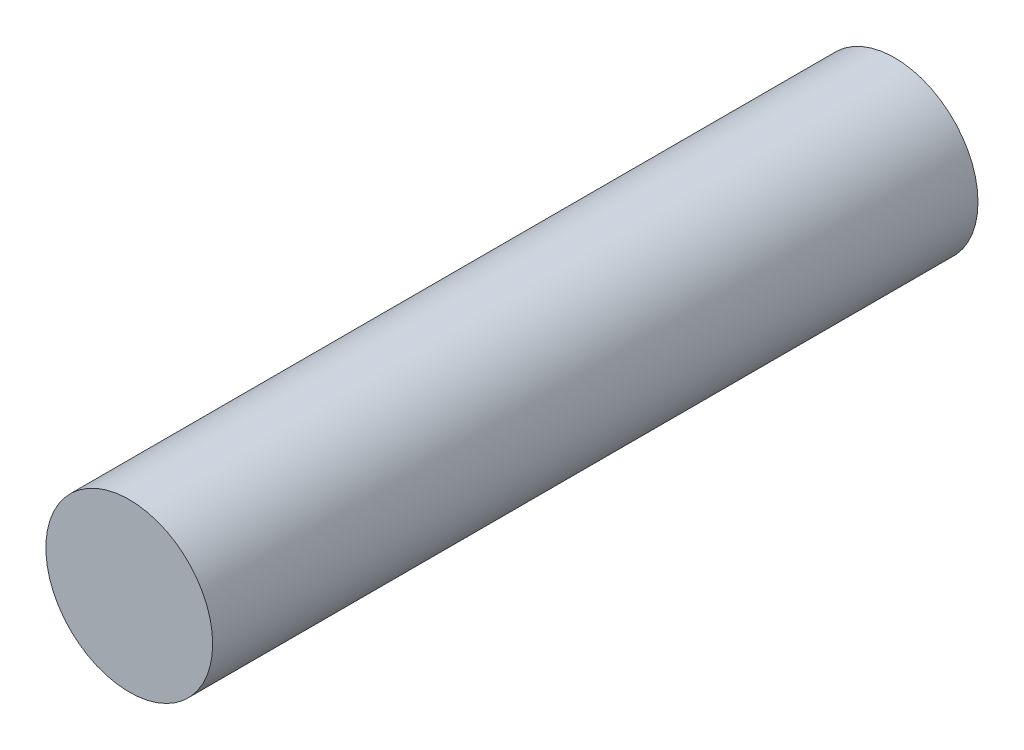
ISO-10303-21;
HEADER;
FILE_DESCRIPTION(('STEP AP214'),'2;1');
FILE_NAME('part.step','',(''),(''),'','','');
FILE_SCHEMA(('AUTOMOTIVE_DESIGN { 1 0 10303 214 1 1 1 1 }'));
ENDSEC;
DATA;
#1=APPLICATION_CONTEXT('core data for automotive mechanical design processes');
#2=APPLICATION_PROTOCOL_DEFINITION('international standard','automotive_design',2000,#1);
#3=PRODUCT_CONTEXT('',#1,'mechanical');
#4=PRODUCT('Part','Part','',(#3));
#5=PRODUCT_RELATED_PRODUCT_CATEGORY('part','',(#4));
#6=PRODUCT_DEFINITION_FORMATION('','',#4);
#7=PRODUCT_DEFINITION_CONTEXT('part definition',#1,'design');
#8=PRODUCT_DEFINITION('design','',#6,#7);
#9=PRODUCT_DEFINITION_SHAPE('','',#8);
#10=(LENGTH_UNIT() NAMED_UNIT(*) SI_UNIT(.MILLI.,.METRE.));
#11=(NAMED_UNIT(*) PLANE_ANGLE_UNIT() SI_UNIT($,.RADIAN.));
#12=(NAMED_UNIT(*) SI_UNIT($,.STERADIAN.) SOLID_ANGLE_UNIT());
#13=UNCERTAINTY_MEASURE_WITH_UNIT(LENGTH_MEASURE(1.E-05),#10,'distance_accuracy_value','');
#14=(GEOMETRIC_REPRESENTATION_CONTEXT(3) GLOBAL_UNCERTAINTY_ASSIGNED_CONTEXT((#13)) GLOBAL_UNIT_ASSIGNED_CONTEXT((#10,
#11,#12)) REPRESENTATION_CONTEXT('',''));
#15=CARTESIAN_POINT('',(0.,0.,0.));
#16=DIRECTION('',(0.,0.,1.));
#17=DIRECTION('',(1.,0.,0.));
#18=AXIS2_PLACEMENT_3D('',#15,#16,#17);
#19=CARTESIAN_POINT('',(0.,0.,22.94));
#20=DIRECTION('',(0.,0.,-1.));
#21=DIRECTION('',(-1.,0.,0.));
#22=AXIS2_PLACEMENT_3D('',#19,#20,#21);
#23=CYLINDRICAL_SURFACE('',#22,2.5);
#24=CARTESIAN_POINT('',(0.,0.,22.94));
#25=DIRECTION('',(0.,0.,1.));
#26=DIRECTION('',(1.,0.,0.));
#27=AXIS2_PLACEMENT_3D('',#24,#25,#26);
#28=CIRCLE('',#27,2.5);
#29=CARTESIAN_POINT('',(2.5,0.,22.94));
#30=VERTEX_POINT('',#29);
#31=EDGE_CURVE('E10',#30,#30,#28,.T.);
#32=ORIENTED_EDGE('',*,*,#31,.F.);
#33=EDGE_LOOP('',(#32));
#34=FACE_BOUND('',#33,.T.);
#35=CARTESIAN_POINT('',(0.,0.,0.));
#36=DIRECTION('',(0.,0.,1.));
#37=DIRECTION('',(1.,0.,0.));
#38=AXIS2_PLACEMENT_3D('',#35,#36,#37);
#39=CIRCLE('',#38,2.5);
#40=CARTESIAN_POINT('',(2.5,0.,0.));
#41=VERTEX_POINT('',#40);
#42=EDGE_CURVE('E36',#41,#41,#39,.T.);
#43=ORIENTED_EDGE('',*,*,#42,.T.);
#44=EDGE_LOOP('',(#43));
#45=FACE_BOUND('',#44,.T.);
#46=ADVANCED_FACE('F33',(#34,#45),#23,.T.);
#47=CARTESIAN_POINT('',(0.,0.,22.94));
#48=DIRECTION('',(0.,0.,1.));
#49=DIRECTION('',(1.,0.,0.));
#50=AXIS2_PLACEMENT_3D('',#47,#48,#49);
#51=PLANE('',#50);
#52=ORIENTED_EDGE('',*,*,#31,.T.);
#53=EDGE_LOOP('',(#52));
#54=FACE_BOUND('',#53,.T.);
#55=ADVANCED_FACE('F48',(#54),#51,.T.);
#56=CARTESIAN_POINT('',(0.,0.,0.));
#57=DIRECTION('',(0.,0.,1.));
#58=DIRECTION('',(1.,0.,0.));
#59=AXIS2_PLACEMENT_3D('',#56,#57,#58);
#60=PLANE('',#59);
#61=ORIENTED_EDGE('',*,*,#42,.F.);
#62=EDGE_LOOP('',(#61));
#63=FACE_BOUND('',#62,.T.);
#64=ADVANCED_FACE('F46',(#63),#60,.F.);
#65=CLOSED_SHELL('',(#46,#55,#64));
#66=MANIFOLD_SOLID_BREP('B2',#65);
#67=ADVANCED_BREP_SHAPE_REPRESENTATION('',(#18,#66),#14);
#68=SHAPE_DEFINITION_REPRESENTATION(#9,#67);
ENDSEC;
END-ISO-10303-21;
